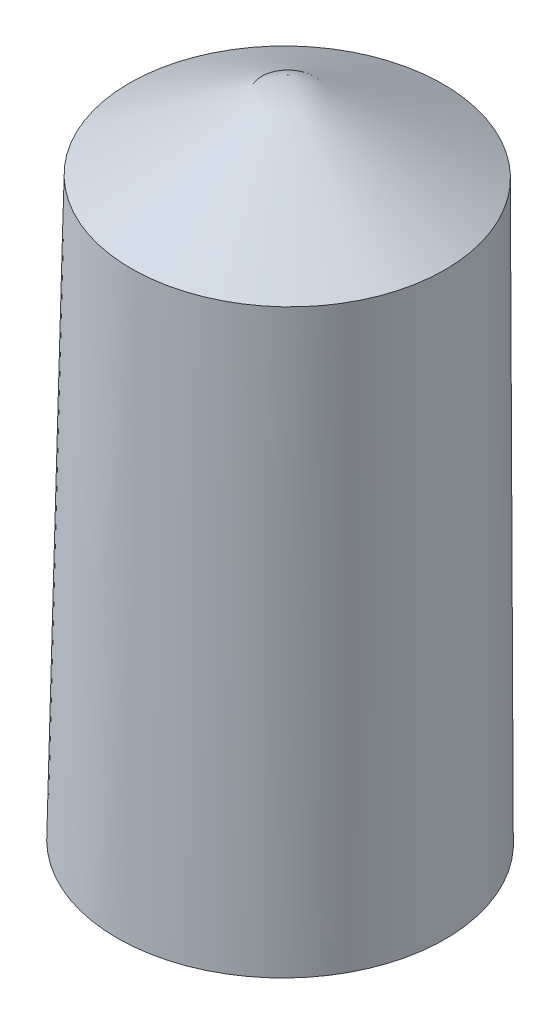
ISO-10303-21;
HEADER;
FILE_DESCRIPTION(('STEP AP214'),'2;1');
FILE_NAME('part.step','',(''),(''),'','','');
FILE_SCHEMA(('AUTOMOTIVE_DESIGN { 1 0 10303 214 1 1 1 1 }'));
ENDSEC;
DATA;
#1=APPLICATION_CONTEXT('core data for automotive mechanical design processes');
#2=APPLICATION_PROTOCOL_DEFINITION('international standard','automotive_design',2000,#1);
#3=PRODUCT_CONTEXT('',#1,'mechanical');
#4=PRODUCT('Part','Part','',(#3));
#5=PRODUCT_RELATED_PRODUCT_CATEGORY('part','',(#4));
#6=PRODUCT_DEFINITION_FORMATION('','',#4);
#7=PRODUCT_DEFINITION_CONTEXT('part definition',#1,'design');
#8=PRODUCT_DEFINITION('design','',#6,#7);
#9=PRODUCT_DEFINITION_SHAPE('','',#8);
#10=(LENGTH_UNIT() NAMED_UNIT(*) SI_UNIT(.MILLI.,.METRE.));
#11=(NAMED_UNIT(*) PLANE_ANGLE_UNIT() SI_UNIT($,.RADIAN.));
#12=(NAMED_UNIT(*) SI_UNIT($,.STERADIAN.) SOLID_ANGLE_UNIT());
#13=UNCERTAINTY_MEASURE_WITH_UNIT(LENGTH_MEASURE(1.E-05),#10,'distance_accuracy_value','');
#14=(GEOMETRIC_REPRESENTATION_CONTEXT(3) GLOBAL_UNCERTAINTY_ASSIGNED_CONTEXT((#13)) GLOBAL_UNIT_ASSIGNED_CONTEXT((#10,
#11,#12)) REPRESENTATION_CONTEXT('',''));
#15=CARTESIAN_POINT('',(0.,0.,0.));
#16=DIRECTION('',(0.,0.,1.));
#17=DIRECTION('',(1.,0.,0.));
#18=AXIS2_PLACEMENT_3D('',#15,#16,#17);
#19=CARTESIAN_POINT('',(0.100065490262031,8.06082680607888,0.));
#20=DIRECTION('',(-0.0124128434207504,-0.999922957691347,0.));
#21=DIRECTION('',(0.999922957691347,-0.0124128434207504,0.));
#22=AXIS2_PLACEMENT_3D('',#19,#20,#21);
#23=CONICAL_SURFACE('',#22,4.90031204109073,1.05961071339855);
#24=CARTESIAN_POINT('',(0.134184238487806,10.8092800397362,0.));
#25=VERTEX_POINT('',#24);
#26=VERTEX_LOOP('',#25);
#27=FACE_BOUND('',#26,.T.);
#28=CARTESIAN_POINT('',(0.100065490262031,8.06082680607888,0.));
#29=DIRECTION('',(0.0124128434207504,0.999922957691347,0.));
#30=DIRECTION('',(-0.999922957691347,0.0124128434207504,0.));
#31=AXIS2_PLACEMENT_3D('',#28,#29,#30);
#32=CIRCLE('',#31,4.90031204109073);
#33=CARTESIAN_POINT('',(-4.79986901947594,8.12165361215775,0.));
#34=VERTEX_POINT('',#33);
#35=EDGE_CURVE('E11',#34,#34,#32,.T.);
#36=ORIENTED_EDGE('',*,*,#35,.T.);
#37=EDGE_LOOP('',(#36));
#38=FACE_BOUND('',#37,.T.);
#39=ADVANCED_FACE('F41',(#27,#38),#23,.T.);
#40=CARTESIAN_POINT('',(-0.123348477657423,-9.93639977764894,0.));
#41=DIRECTION('',(-0.0124128434207504,-0.999922957691347,0.));
#42=DIRECTION('',(0.999922957691347,-0.0124128434207504,0.));
#43=AXIS2_PLACEMENT_3D('',#40,#41,#42);
#44=CONICAL_SURFACE('',#43,5.12374322266424,0.0124131622019459);
#45=ORIENTED_EDGE('',*,*,#35,.F.);
#46=EDGE_LOOP('',(#45));
#47=FACE_BOUND('',#46,.T.);
#48=CARTESIAN_POINT('',(-0.123348477657423,-9.93639977764894,0.));
#49=DIRECTION('',(0.0124128434207504,0.999922957691347,0.));
#50=DIRECTION('',(-0.999922957691347,0.0124128434207504,0.));
#51=AXIS2_PLACEMENT_3D('',#48,#49,#50);
#52=CIRCLE('',#51,5.12374322266424);
#53=CARTESIAN_POINT('',(-5.24669695531493,-9.87279955529788,0.));
#54=VERTEX_POINT('',#53);
#55=EDGE_CURVE('E48',#54,#54,#52,.T.);
#56=ORIENTED_EDGE('',*,*,#55,.T.);
#57=EDGE_LOOP('',(#56));
#58=FACE_BOUND('',#57,.T.);
#59=ADVANCED_FACE('F62',(#47,#58),#44,.T.);
#60=CARTESIAN_POINT('',(-0.124118871066364,-9.99845921318212,0.));
#61=DIRECTION('',(0.0124128434207504,0.999922957691347,0.));
#62=DIRECTION('',(-0.999922957691347,0.0124128434207504,0.));
#63=AXIS2_PLACEMENT_3D('',#60,#61,#62);
#64=CONICAL_SURFACE('',#63,0.124128434207504,1.55838316459295);
#65=CARTESIAN_POINT('',(-0.124118871066364,-9.99845921318212,0.));
#66=DIRECTION('',(0.0124128434207504,0.999922957691347,0.));
#67=DIRECTION('',(-0.999922957691347,0.0124128434207504,0.));
#68=AXIS2_PLACEMENT_3D('',#65,#66,#67);
#69=CIRCLE('',#68,0.124128434207504);
#70=CARTESIAN_POINT('',(-0.2482377421327,-9.99691842636424,0.));
#71=VERTEX_POINT('',#70);
#72=EDGE_CURVE('E76',#71,#71,#69,.T.);
#73=CARTESIAN_POINT('',(-5.24669695531493,-9.87279955529788,0.));
#74=CARTESIAN_POINT('',(-5.19462967184428,-9.87409246020482,0.));
#75=CARTESIAN_POINT('',(-5.14256238837363,-9.87538536511176,0.));
#76=CARTESIAN_POINT('',(-5.03842782143234,-9.87797117492564,0.));
#77=CARTESIAN_POINT('',(-4.98636053796169,-9.87926407983258,0.));
#78=CARTESIAN_POINT('',(-4.88222597102039,-9.88184988964646,0.));
#79=CARTESIAN_POINT('',(-4.83015868754974,-9.88314279455341,0.));
#80=CARTESIAN_POINT('',(-4.72602412060844,-9.88572860436729,0.));
#81=CARTESIAN_POINT('',(-4.6739568371378,-9.88702150927423,0.));
#82=CARTESIAN_POINT('',(-4.5698222701965,-9.88960731908811,0.));
#83=CARTESIAN_POINT('',(-4.51775498672585,-9.89090022399505,0.));
#84=CARTESIAN_POINT('',(-4.41362041978456,-9.89348603380894,0.));
#85=CARTESIAN_POINT('',(-4.36155313631391,-9.89477893871588,0.));
#86=CARTESIAN_POINT('',(-4.25741856937261,-9.89736474852976,0.));
#87=CARTESIAN_POINT('',(-4.20535128590196,-9.8986576534367,0.));
#88=CARTESIAN_POINT('',(-4.10121671896067,-9.90124346325058,0.));
#89=CARTESIAN_POINT('',(-4.04914943549002,-9.90253636815753,0.));
#90=CARTESIAN_POINT('',(-3.94501486854872,-9.90512217797141,0.));
#91=CARTESIAN_POINT('',(-3.89294758507807,-9.90641508287835,0.));
#92=CARTESIAN_POINT('',(-3.78881301813678,-9.90900089269223,0.));
#93=CARTESIAN_POINT('',(-3.73674573466613,-9.91029379759917,0.));
#94=CARTESIAN_POINT('',(-3.63261116772483,-9.91287960741306,0.));
#95=CARTESIAN_POINT('',(-3.58054388425419,-9.91417251232,0.));
#96=CARTESIAN_POINT('',(-3.47640931731289,-9.91675832213388,0.));
#97=CARTESIAN_POINT('',(-3.42434203384224,-9.91805122704082,0.));
#98=CARTESIAN_POINT('',(-3.32020746690094,-9.9206370368547,0.));
#99=CARTESIAN_POINT('',(-3.2681401834303,-9.92192994176164,0.));
#100=CARTESIAN_POINT('',(-3.164005616489,-9.92451575157553,0.));
#101=CARTESIAN_POINT('',(-3.11193833301835,-9.92580865648247,0.));
#102=CARTESIAN_POINT('',(-3.00780376607705,-9.92839446629635,0.));
#103=CARTESIAN_POINT('',(-2.95573648260641,-9.92968737120329,0.));
#104=CARTESIAN_POINT('',(-2.85160191566511,-9.93227318101717,0.));
#105=CARTESIAN_POINT('',(-2.79953463219446,-9.93356608592412,0.));
#106=CARTESIAN_POINT('',(-2.69540006525316,-9.936151895738,0.));
#107=CARTESIAN_POINT('',(-2.64333278178252,-9.93744480064494,0.));
#108=CARTESIAN_POINT('',(-2.53919821484122,-9.94003061045882,0.));
#109=CARTESIAN_POINT('',(-2.48713093137057,-9.94132351536576,0.));
#110=CARTESIAN_POINT('',(-2.38299636442928,-9.94390932517965,0.));
#111=CARTESIAN_POINT('',(-2.33092908095863,-9.94520223008659,0.));
#112=CARTESIAN_POINT('',(-2.22679451401733,-9.94778803990047,0.));
#113=CARTESIAN_POINT('',(-2.17472723054668,-9.94908094480741,0.));
#114=CARTESIAN_POINT('',(-2.07059266360539,-9.95166675462129,0.));
#115=CARTESIAN_POINT('',(-2.01852538013474,-9.95295965952824,0.));
#116=CARTESIAN_POINT('',(-1.91439081319344,-9.95554546934212,0.));
#117=CARTESIAN_POINT('',(-1.86232352972279,-9.95683837424906,0.));
#118=CARTESIAN_POINT('',(-1.7581889627815,-9.95942418406294,0.));
#119=CARTESIAN_POINT('',(-1.70612167931085,-9.96071708896988,0.));
#120=CARTESIAN_POINT('',(-1.60198711236955,-9.96330289878377,0.));
#121=CARTESIAN_POINT('',(-1.54991982889891,-9.96459580369071,0.));
#122=CARTESIAN_POINT('',(-1.44578526195761,-9.96718161350459,0.));
#123=CARTESIAN_POINT('',(-1.39371797848696,-9.96847451841153,0.));
#124=CARTESIAN_POINT('',(-1.28958341154566,-9.97106032822541,0.));
#125=CARTESIAN_POINT('',(-1.23751612807502,-9.97235323313236,0.));
#126=CARTESIAN_POINT('',(-1.13338156113372,-9.97493904294624,0.));
#127=CARTESIAN_POINT('',(-1.08131427766307,-9.97623194785318,0.));
#128=CARTESIAN_POINT('',(-0.977179710721775,-9.97881775766706,0.));
#129=CARTESIAN_POINT('',(-0.925112427251127,-9.980110662574,0.));
#130=CARTESIAN_POINT('',(-0.82097786030983,-9.98269647238788,0.));
#131=CARTESIAN_POINT('',(-0.768910576839182,-9.98398937729483,0.));
#132=CARTESIAN_POINT('',(-0.664776009897886,-9.98657518710871,0.));
#133=CARTESIAN_POINT('',(-0.612708726427237,-9.98786809201565,0.));
#134=CARTESIAN_POINT('',(-0.508574159485941,-9.99045390182953,0.));
#135=CARTESIAN_POINT('',(-0.456506876015293,-9.99174680673648,0.));
#136=CARTESIAN_POINT('',(-0.352372309073996,-9.99433261655036,0.));
#137=CARTESIAN_POINT('',(-0.300305025603348,-9.9956255214573,0.));
#138=CARTESIAN_POINT('',(-0.2482377421327,-9.99691842636424,0.));
#139=B_SPLINE_CURVE_WITH_KNOTS('',3,(#73,#74,#75,#76,#77,#78,#79,#80,#81,#82,#83,#84,#85,#86,
#87,#88,#89,#90,#91,#92,#93,#94,#95,#96,#97,#98,#99,#100,#101,#102,#103,#104,#105,#106,#107,
#108,#109,#110,#111,#112,#113,#114,#115,#116,#117,#118,#119,#120,#121,#122,#123,#124,#125,#126,
#127,#128,#129,#130,#131,#132,#133,#134,#135,#136,#137,#138),.UNSPECIFIED.,.F.,.F.,(4,2,2,2,2,2,
2,2,2,2,2,2,2,2,2,2,2,2,2,2,2,2,2,2,2,2,2,2,2,2,2,2,4),(0.,0.156250000000003,0.312500000000006,
0.468750000000011,0.625000000000014,0.781250000000017,0.93750000000002,1.09375000000002,
1.25000000000003,1.40625000000003,1.56250000000003,1.71875000000004,1.87500000000004,
2.03125000000004,2.18750000000005,2.34375000000005,2.50000000000006,2.65625000000006,
2.81250000000006,2.96875000000007,3.12500000000007,3.28125000000007,3.43750000000008,
3.59375000000008,3.75000000000008,3.90625000000009,4.06250000000009,4.21875000000009,
4.3750000000001,4.5312500000001,4.6875000000001,4.84375000000011,5.00000000000011),.UNSPECIFIED.);
#140=EDGE_CURVE('BSEAM56',#54,#71,#139,.T.);
#141=ORIENTED_EDGE('',*,*,#55,.F.);
#142=ORIENTED_EDGE('',*,*,#72,.T.);
#143=ORIENTED_EDGE('',*,*,#140,.T.);
#144=ORIENTED_EDGE('',*,*,#140,.F.);
#145=EDGE_LOOP('',(#141,#143,#142,#144));
#146=FACE_BOUND('',#145,.T.);
#147=ADVANCED_FACE('F56',(#146),#64,.T.);
#148=CARTESIAN_POINT('',(0.,0.,0.));
#149=DIRECTION('',(-0.0124128434207504,-0.999922957691347,0.));
#150=DIRECTION('',(0.999922957691347,-0.0124128434207504,0.));
#151=AXIS2_PLACEMENT_3D('',#148,#149,#150);
#152=CONICAL_SURFACE('',#151,0.,0.0124131622019457);
#153=ORIENTED_EDGE('',*,*,#72,.F.);
#154=EDGE_LOOP('',(#153));
#155=FACE_BOUND('',#154,.T.);
#156=CARTESIAN_POINT('',(0.,0.,0.));
#157=VERTEX_POINT('',#156);
#158=VERTEX_LOOP('',#157);
#159=FACE_BOUND('',#158,.T.);
#160=ADVANCED_FACE('F54',(#155,#159),#152,.F.);
#161=CLOSED_SHELL('',(#39,#59,#147,#160));
#162=MANIFOLD_SOLID_BREP('B2',#161);
#163=ADVANCED_BREP_SHAPE_REPRESENTATION('',(#18,#162),#14);
#164=SHAPE_DEFINITION_REPRESENTATION(#9,#163);
ENDSEC;
END-ISO-10303-21;
